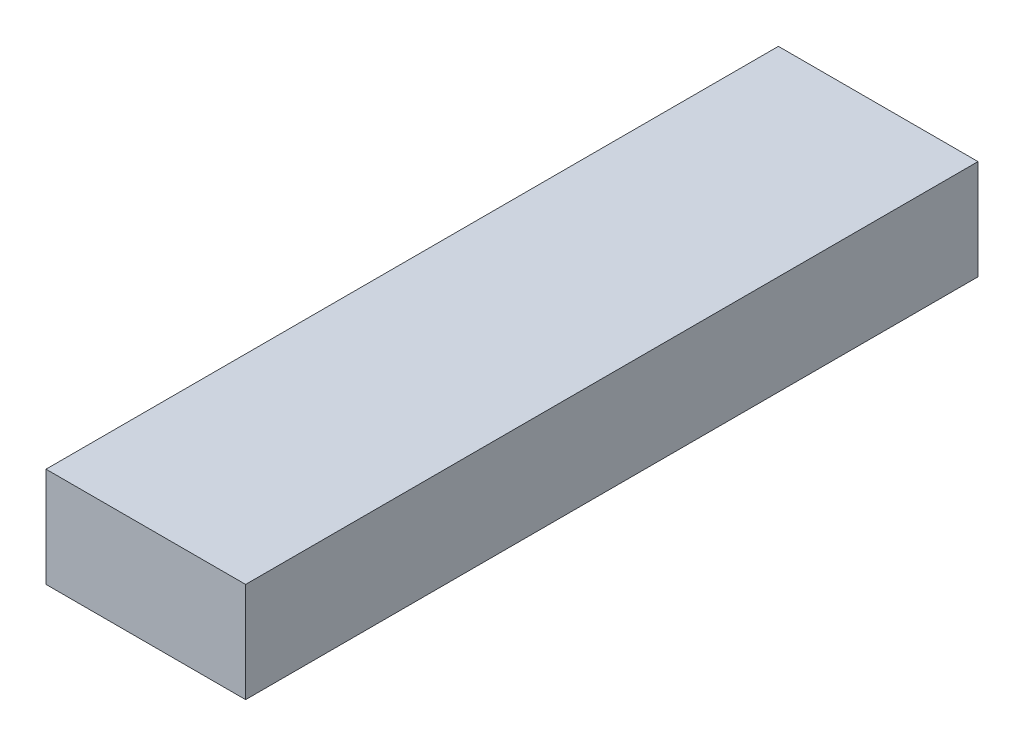
ISO-10303-21;
HEADER;
FILE_DESCRIPTION(('STEP AP214'),'2;1');
FILE_NAME('part.step','',(''),(''),'','','');
FILE_SCHEMA(('AUTOMOTIVE_DESIGN { 1 0 10303 214 1 1 1 1 }'));
ENDSEC;
DATA;
#1=APPLICATION_CONTEXT('core data for automotive mechanical design processes');
#2=APPLICATION_PROTOCOL_DEFINITION('international standard','automotive_design',2000,#1);
#3=PRODUCT_CONTEXT('',#1,'mechanical');
#4=PRODUCT('Part','Part','',(#3));
#5=PRODUCT_RELATED_PRODUCT_CATEGORY('part','',(#4));
#6=PRODUCT_DEFINITION_FORMATION('','',#4);
#7=PRODUCT_DEFINITION_CONTEXT('part definition',#1,'design');
#8=PRODUCT_DEFINITION('design','',#6,#7);
#9=PRODUCT_DEFINITION_SHAPE('','',#8);
#10=(LENGTH_UNIT() NAMED_UNIT(*) SI_UNIT(.MILLI.,.METRE.));
#11=(NAMED_UNIT(*) PLANE_ANGLE_UNIT() SI_UNIT($,.RADIAN.));
#12=(NAMED_UNIT(*) SI_UNIT($,.STERADIAN.) SOLID_ANGLE_UNIT());
#13=UNCERTAINTY_MEASURE_WITH_UNIT(LENGTH_MEASURE(1.E-05),#10,'distance_accuracy_value','');
#14=(GEOMETRIC_REPRESENTATION_CONTEXT(3) GLOBAL_UNCERTAINTY_ASSIGNED_CONTEXT((#13)) GLOBAL_UNIT_ASSIGNED_CONTEXT((#10,
#11,#12)) REPRESENTATION_CONTEXT('',''));
#15=CARTESIAN_POINT('',(0.,0.,0.));
#16=DIRECTION('',(0.,0.,1.));
#17=DIRECTION('',(1.,0.,0.));
#18=AXIS2_PLACEMENT_3D('',#15,#16,#17);
#19=CARTESIAN_POINT('',(4.,4.,-14.6760260600609));
#20=DIRECTION('',(-1.,0.,0.));
#21=DIRECTION('',(0.,0.,1.));
#22=AXIS2_PLACEMENT_3D('',#19,#20,#21);
#23=PLANE('',#22);
#24=DIRECTION('',(0.,0.,-1.));
#25=VECTOR('',#24,1.);
#26=CARTESIAN_POINT('',(4.,0.,-14.6760260600609));
#27=LINE('',#26,#25);
#28=CARTESIAN_POINT('',(4.,0.,14.6760260600609));
#29=VERTEX_POINT('',#28);
#30=CARTESIAN_POINT('',(4.,0.,-14.6760260600609));
#31=VERTEX_POINT('',#30);
#32=EDGE_CURVE('E95',#29,#31,#27,.T.);
#33=ORIENTED_EDGE('',*,*,#32,.T.);
#34=DIRECTION('',(0.,-1.,0.));
#35=VECTOR('',#34,1.);
#36=CARTESIAN_POINT('',(4.,4.,-14.6760260600609));
#37=LINE('',#36,#35);
#38=CARTESIAN_POINT('',(4.,4.,-14.6760260600609));
#39=VERTEX_POINT('',#38);
#40=EDGE_CURVE('E11',#39,#31,#37,.T.);
#41=ORIENTED_EDGE('',*,*,#40,.F.);
#42=DIRECTION('',(0.,0.,-1.));
#43=VECTOR('',#42,1.);
#44=CARTESIAN_POINT('',(4.,4.,-14.6760260600609));
#45=LINE('',#44,#43);
#46=CARTESIAN_POINT('',(4.,4.,14.6760260600609));
#47=VERTEX_POINT('',#46);
#48=EDGE_CURVE('E83',#47,#39,#45,.T.);
#49=ORIENTED_EDGE('',*,*,#48,.F.);
#50=DIRECTION('',(0.,-1.,0.));
#51=VECTOR('',#50,1.);
#52=CARTESIAN_POINT('',(4.,4.,14.6760260600609));
#53=LINE('',#52,#51);
#54=EDGE_CURVE('E91',#47,#29,#53,.T.);
#55=ORIENTED_EDGE('',*,*,#54,.T.);
#56=EDGE_LOOP('',(#33,#41,#49,#55));
#57=FACE_BOUND('',#56,.T.);
#58=ADVANCED_FACE('F32',(#57),#23,.F.);
#59=CARTESIAN_POINT('',(-4.,4.,-14.6760260600609));
#60=DIRECTION('',(0.,0.,1.));
#61=DIRECTION('',(1.,0.,0.));
#62=AXIS2_PLACEMENT_3D('',#59,#60,#61);
#63=PLANE('',#62);
#64=DIRECTION('',(-1.,0.,0.));
#65=VECTOR('',#64,1.);
#66=CARTESIAN_POINT('',(-4.,0.,-14.6760260600609));
#67=LINE('',#66,#65);
#68=CARTESIAN_POINT('',(-4.,0.,-14.6760260600609));
#69=VERTEX_POINT('',#68);
#70=EDGE_CURVE('E87',#31,#69,#67,.T.);
#71=ORIENTED_EDGE('',*,*,#70,.T.);
#72=DIRECTION('',(0.,-1.,0.));
#73=VECTOR('',#72,1.);
#74=CARTESIAN_POINT('',(-4.,4.,-14.6760260600609));
#75=LINE('',#74,#73);
#76=CARTESIAN_POINT('',(-4.,4.,-14.6760260600609));
#77=VERTEX_POINT('',#76);
#78=EDGE_CURVE('E40',#77,#69,#75,.T.);
#79=ORIENTED_EDGE('',*,*,#78,.F.);
#80=DIRECTION('',(-1.,0.,0.));
#81=VECTOR('',#80,1.);
#82=CARTESIAN_POINT('',(-4.,4.,-14.6760260600609));
#83=LINE('',#82,#81);
#84=EDGE_CURVE('E78',#39,#77,#83,.T.);
#85=ORIENTED_EDGE('',*,*,#84,.F.);
#86=ORIENTED_EDGE('',*,*,#40,.T.);
#87=EDGE_LOOP('',(#71,#79,#85,#86));
#88=FACE_BOUND('',#87,.T.);
#89=ADVANCED_FACE('F86',(#88),#63,.F.);
#90=CARTESIAN_POINT('',(-4.,4.,-14.6760260600609));
#91=DIRECTION('',(1.,0.,0.));
#92=DIRECTION('',(0.,0.,-1.));
#93=AXIS2_PLACEMENT_3D('',#90,#91,#92);
#94=PLANE('',#93);
#95=DIRECTION('',(0.,0.,1.));
#96=VECTOR('',#95,1.);
#97=CARTESIAN_POINT('',(-4.,0.,-14.6760260600609));
#98=LINE('',#97,#96);
#99=CARTESIAN_POINT('',(-4.,0.,14.6760260600609));
#100=VERTEX_POINT('',#99);
#101=EDGE_CURVE('E65',#69,#100,#98,.T.);
#102=ORIENTED_EDGE('',*,*,#101,.T.);
#103=DIRECTION('',(0.,-1.,0.));
#104=VECTOR('',#103,1.);
#105=CARTESIAN_POINT('',(-4.,4.,14.6760260600609));
#106=LINE('',#105,#104);
#107=CARTESIAN_POINT('',(-4.,4.,14.6760260600609));
#108=VERTEX_POINT('',#107);
#109=EDGE_CURVE('E88',#108,#100,#106,.T.);
#110=ORIENTED_EDGE('',*,*,#109,.F.);
#111=DIRECTION('',(0.,0.,1.));
#112=VECTOR('',#111,1.);
#113=CARTESIAN_POINT('',(-4.,4.,-14.6760260600609));
#114=LINE('',#113,#112);
#115=EDGE_CURVE('E81',#77,#108,#114,.T.);
#116=ORIENTED_EDGE('',*,*,#115,.F.);
#117=ORIENTED_EDGE('',*,*,#78,.T.);
#118=EDGE_LOOP('',(#102,#110,#116,#117));
#119=FACE_BOUND('',#118,.T.);
#120=ADVANCED_FACE('F89',(#119),#94,.F.);
#121=CARTESIAN_POINT('',(-4.,4.,14.6760260600609));
#122=DIRECTION('',(0.,0.,-1.));
#123=DIRECTION('',(-1.,0.,0.));
#124=AXIS2_PLACEMENT_3D('',#121,#122,#123);
#125=PLANE('',#124);
#126=DIRECTION('',(1.,0.,0.));
#127=VECTOR('',#126,1.);
#128=CARTESIAN_POINT('',(-4.,0.,14.6760260600609));
#129=LINE('',#128,#127);
#130=EDGE_CURVE('E71',#100,#29,#129,.T.);
#131=ORIENTED_EDGE('',*,*,#130,.T.);
#132=ORIENTED_EDGE('',*,*,#54,.F.);
#133=DIRECTION('',(1.,0.,0.));
#134=VECTOR('',#133,1.);
#135=CARTESIAN_POINT('',(-4.,4.,14.6760260600609));
#136=LINE('',#135,#134);
#137=EDGE_CURVE('E48',#108,#47,#136,.T.);
#138=ORIENTED_EDGE('',*,*,#137,.F.);
#139=ORIENTED_EDGE('',*,*,#109,.T.);
#140=EDGE_LOOP('',(#131,#132,#138,#139));
#141=FACE_BOUND('',#140,.T.);
#142=ADVANCED_FACE('F102',(#141),#125,.F.);
#143=CARTESIAN_POINT('',(0.,4.,0.));
#144=DIRECTION('',(0.,1.,0.));
#145=DIRECTION('',(0.,0.,1.));
#146=AXIS2_PLACEMENT_3D('',#143,#144,#145);
#147=PLANE('',#146);
#148=ORIENTED_EDGE('',*,*,#48,.T.);
#149=ORIENTED_EDGE('',*,*,#84,.T.);
#150=ORIENTED_EDGE('',*,*,#115,.T.);
#151=ORIENTED_EDGE('',*,*,#137,.T.);
#152=EDGE_LOOP('',(#148,#149,#150,#151));
#153=FACE_BOUND('',#152,.T.);
#154=ADVANCED_FACE('F79',(#153),#147,.T.);
#155=CARTESIAN_POINT('',(0.,0.,0.));
#156=DIRECTION('',(0.,1.,0.));
#157=DIRECTION('',(0.,0.,1.));
#158=AXIS2_PLACEMENT_3D('',#155,#156,#157);
#159=PLANE('',#158);
#160=ORIENTED_EDGE('',*,*,#32,.F.);
#161=ORIENTED_EDGE('',*,*,#130,.F.);
#162=ORIENTED_EDGE('',*,*,#101,.F.);
#163=ORIENTED_EDGE('',*,*,#70,.F.);
#164=EDGE_LOOP('',(#160,#161,#162,#163));
#165=FACE_BOUND('',#164,.T.);
#166=ADVANCED_FACE('F105',(#165),#159,.F.);
#167=CLOSED_SHELL('',(#58,#89,#120,#142,#154,#166));
#168=MANIFOLD_SOLID_BREP('B2',#167);
#169=ADVANCED_BREP_SHAPE_REPRESENTATION('',(#18,#168),#14);
#170=SHAPE_DEFINITION_REPRESENTATION(#9,#169);
ENDSEC;
END-ISO-10303-21;
